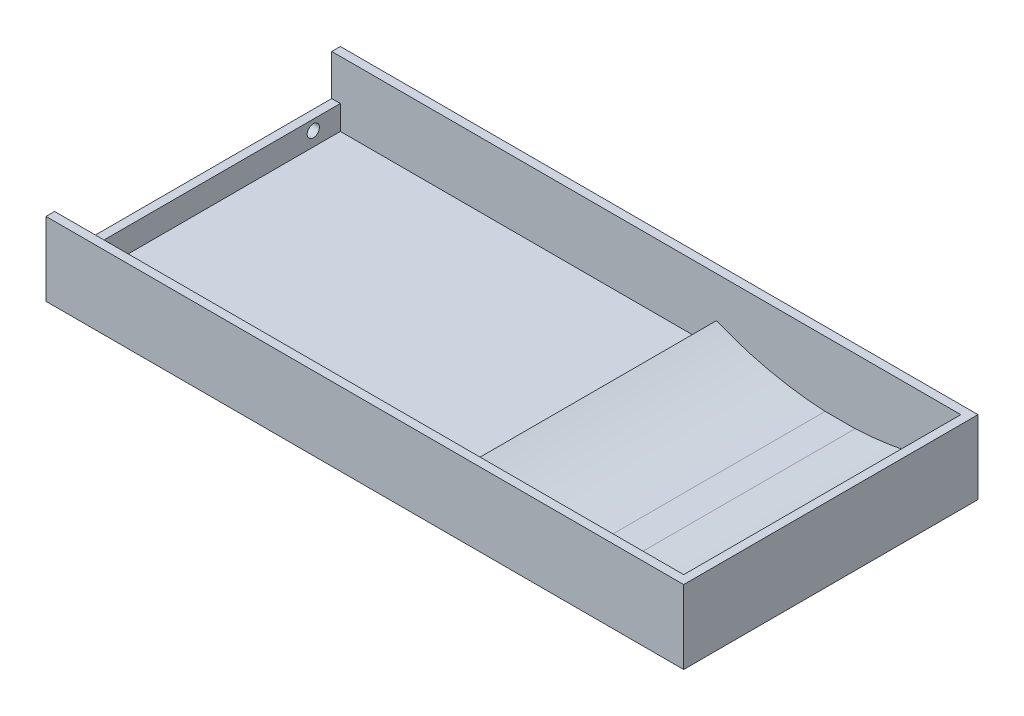
ISO-10303-21;
HEADER;
FILE_DESCRIPTION(('STEP AP214'),'2;1');
FILE_NAME('part.step','',(''),(''),'','','');
FILE_SCHEMA(('AUTOMOTIVE_DESIGN { 1 0 10303 214 1 1 1 1 }'));
ENDSEC;
DATA;
#1=APPLICATION_CONTEXT('core data for automotive mechanical design processes');
#2=APPLICATION_PROTOCOL_DEFINITION('international standard','automotive_design',2000,#1);
#3=PRODUCT_CONTEXT('',#1,'mechanical');
#4=PRODUCT('Part','Part','',(#3));
#5=PRODUCT_RELATED_PRODUCT_CATEGORY('part','',(#4));
#6=PRODUCT_DEFINITION_FORMATION('','',#4);
#7=PRODUCT_DEFINITION_CONTEXT('part definition',#1,'design');
#8=PRODUCT_DEFINITION('design','',#6,#7);
#9=PRODUCT_DEFINITION_SHAPE('','',#8);
#10=(LENGTH_UNIT() NAMED_UNIT(*) SI_UNIT(.MILLI.,.METRE.));
#11=(NAMED_UNIT(*) PLANE_ANGLE_UNIT() SI_UNIT($,.RADIAN.));
#12=(NAMED_UNIT(*) SI_UNIT($,.STERADIAN.) SOLID_ANGLE_UNIT());
#13=UNCERTAINTY_MEASURE_WITH_UNIT(LENGTH_MEASURE(1.E-05),#10,'distance_accuracy_value','');
#14=(GEOMETRIC_REPRESENTATION_CONTEXT(3) GLOBAL_UNCERTAINTY_ASSIGNED_CONTEXT((#13)) GLOBAL_UNIT_ASSIGNED_CONTEXT((#10,
#11,#12)) REPRESENTATION_CONTEXT('',''));
#15=CARTESIAN_POINT('',(0.,0.,0.));
#16=DIRECTION('',(0.,0.,1.));
#17=DIRECTION('',(1.,0.,0.));
#18=AXIS2_PLACEMENT_3D('',#15,#16,#17);
#19=CARTESIAN_POINT('',(130.,30.,56.5));
#20=DIRECTION('',(0.,0.,-1.));
#21=DIRECTION('',(-1.,0.,0.));
#22=AXIS2_PLACEMENT_3D('',#19,#20,#21);
#23=PLANE('',#22);
#24=DIRECTION('',(0.,-1.,0.));
#25=VECTOR('',#24,1.);
#26=CARTESIAN_POINT('',(-126.5,30.,56.5));
#27=LINE('',#26,#25);
#28=CARTESIAN_POINT('',(-126.5,13.3588713143466,56.5));
#29=VERTEX_POINT('',#28);
#30=CARTESIAN_POINT('',(-126.5,3.5,56.5));
#31=VERTEX_POINT('',#30);
#32=EDGE_CURVE('E187',#29,#31,#27,.T.);
#33=ORIENTED_EDGE('',*,*,#32,.F.);
#34=DIRECTION('',(-1.,0.,0.));
#35=VECTOR('',#34,1.);
#36=CARTESIAN_POINT('',(-79.2,13.3588713143466,56.5));
#37=LINE('',#36,#35);
#38=CARTESIAN_POINT('',(-130.,13.3588713143466,56.5));
#39=VERTEX_POINT('',#38);
#40=EDGE_CURVE('E144',#29,#39,#37,.T.);
#41=ORIENTED_EDGE('',*,*,#40,.T.);
#42=DIRECTION('',(0.,1.,0.));
#43=VECTOR('',#42,1.);
#44=CARTESIAN_POINT('',(-130.,13.3588713143466,56.5));
#45=LINE('',#44,#43);
#46=CARTESIAN_POINT('',(-130.,30.,56.5));
#47=VERTEX_POINT('',#46);
#48=EDGE_CURVE('E154',#39,#47,#45,.T.);
#49=ORIENTED_EDGE('',*,*,#48,.T.);
#50=DIRECTION('',(1.,0.,0.));
#51=VECTOR('',#50,1.);
#52=CARTESIAN_POINT('',(130.,30.,56.5));
#53=LINE('',#52,#51);
#54=CARTESIAN_POINT('',(126.5,30.,56.5));
#55=VERTEX_POINT('',#54);
#56=EDGE_CURVE('E202',#47,#55,#53,.T.);
#57=ORIENTED_EDGE('',*,*,#56,.T.);
#58=DIRECTION('',(0.,-1.,0.));
#59=VECTOR('',#58,1.);
#60=CARTESIAN_POINT('',(126.5,30.,56.5));
#61=LINE('',#60,#59);
#62=CARTESIAN_POINT('',(126.5,12.8468283409916,56.5));
#63=VERTEX_POINT('',#62);
#64=EDGE_CURVE('E190',#55,#63,#61,.T.);
#65=ORIENTED_EDGE('',*,*,#64,.T.);
#66=CARTESIAN_POINT('',(77.3064193913041,135.633379651327,56.5));
#67=DIRECTION('',(0.,0.,-1.));
#68=DIRECTION('',(-1.,0.,0.));
#69=AXIS2_PLACEMENT_3D('',#66,#67,#68);
#70=CIRCLE('',#69,132.27450833698);
#71=CARTESIAN_POINT('',(83.4150638979187,3.5,56.5));
#72=VERTEX_POINT('',#71);
#73=EDGE_CURVE('E59',#72,#63,#70,.F.);
#74=ORIENTED_EDGE('',*,*,#73,.F.);
#75=DIRECTION('',(1.,0.,0.));
#76=VECTOR('',#75,1.);
#77=CARTESIAN_POINT('',(130.,3.5,56.5));
#78=LINE('',#77,#76);
#79=CARTESIAN_POINT('',(71.1977748846894,3.5,56.5));
#80=VERTEX_POINT('',#79);
#81=EDGE_CURVE('E186',#80,#72,#78,.T.);
#82=ORIENTED_EDGE('',*,*,#81,.F.);
#83=CARTESIAN_POINT('',(77.3064193913041,135.633379651327,56.5));
#84=DIRECTION('',(0.,0.,-1.));
#85=DIRECTION('',(-1.,0.,0.));
#86=AXIS2_PLACEMENT_3D('',#83,#84,#85);
#87=CIRCLE('',#86,132.27450833698);
#88=CARTESIAN_POINT('',(26.8535684635359,13.3588713143466,56.5));
#89=VERTEX_POINT('',#88);
#90=EDGE_CURVE('E180',#89,#80,#87,.F.);
#91=ORIENTED_EDGE('',*,*,#90,.F.);
#92=DIRECTION('',(0.,1.,0.));
#93=VECTOR('',#92,1.);
#94=CARTESIAN_POINT('',(26.8535684635359,30.,56.5));
#95=LINE('',#94,#93);
#96=CARTESIAN_POINT('',(26.8535684635359,3.5,56.5));
#97=VERTEX_POINT('',#96);
#98=EDGE_CURVE('E177',#97,#89,#95,.T.);
#99=ORIENTED_EDGE('',*,*,#98,.F.);
#100=EDGE_CURVE('E194',#31,#97,#78,.T.);
#101=ORIENTED_EDGE('',*,*,#100,.F.);
#102=EDGE_LOOP('',(#33,#41,#49,#57,#65,#74,#82,#91,#99,#101));
#103=FACE_BOUND('',#102,.T.);
#104=ADVANCED_FACE('F35',(#103),#23,.T.);
#105=CARTESIAN_POINT('',(130.,30.,-56.5));
#106=DIRECTION('',(0.,0.,1.));
#107=DIRECTION('',(1.,0.,0.));
#108=AXIS2_PLACEMENT_3D('',#105,#106,#107);
#109=PLANE('',#108);
#110=DIRECTION('',(-1.,0.,0.));
#111=VECTOR('',#110,1.);
#112=CARTESIAN_POINT('',(-79.2,13.3588713143466,-56.5));
#113=LINE('',#112,#111);
#114=CARTESIAN_POINT('',(-126.5,13.3588713143466,-56.5));
#115=VERTEX_POINT('',#114);
#116=CARTESIAN_POINT('',(-130.,13.3588713143466,-56.5));
#117=VERTEX_POINT('',#116);
#118=EDGE_CURVE('E52',#115,#117,#113,.T.);
#119=ORIENTED_EDGE('',*,*,#118,.F.);
#120=DIRECTION('',(0.,-1.,0.));
#121=VECTOR('',#120,1.);
#122=CARTESIAN_POINT('',(-126.5,30.,-56.5));
#123=LINE('',#122,#121);
#124=CARTESIAN_POINT('',(-126.5,3.5,-56.5));
#125=VERTEX_POINT('',#124);
#126=EDGE_CURVE('E191',#115,#125,#123,.T.);
#127=ORIENTED_EDGE('',*,*,#126,.T.);
#128=DIRECTION('',(-1.,0.,0.));
#129=VECTOR('',#128,1.);
#130=CARTESIAN_POINT('',(130.,3.5,-56.5));
#131=LINE('',#130,#129);
#132=CARTESIAN_POINT('',(26.8535684635359,3.5,-56.5));
#133=VERTEX_POINT('',#132);
#134=EDGE_CURVE('E196',#133,#125,#131,.T.);
#135=ORIENTED_EDGE('',*,*,#134,.F.);
#136=DIRECTION('',(0.,1.,0.));
#137=VECTOR('',#136,1.);
#138=CARTESIAN_POINT('',(26.8535684635359,0.,-56.5));
#139=LINE('',#138,#137);
#140=CARTESIAN_POINT('',(26.8535684635359,13.3588713143466,-56.5));
#141=VERTEX_POINT('',#140);
#142=EDGE_CURVE('E172',#133,#141,#139,.T.);
#143=ORIENTED_EDGE('',*,*,#142,.T.);
#144=CARTESIAN_POINT('',(77.3064193913041,135.633379651327,-56.5));
#145=DIRECTION('',(0.,0.,1.));
#146=DIRECTION('',(1.,0.,0.));
#147=AXIS2_PLACEMENT_3D('',#144,#145,#146);
#148=CIRCLE('',#147,132.27450833698);
#149=CARTESIAN_POINT('',(71.1977748846894,3.5,-56.5));
#150=VERTEX_POINT('',#149);
#151=EDGE_CURVE('E169',#141,#150,#148,.T.);
#152=ORIENTED_EDGE('',*,*,#151,.T.);
#153=CARTESIAN_POINT('',(83.4150638979187,3.5,-56.5));
#154=VERTEX_POINT('',#153);
#155=EDGE_CURVE('E200',#154,#150,#131,.T.);
#156=ORIENTED_EDGE('',*,*,#155,.F.);
#157=CARTESIAN_POINT('',(77.3064193913041,135.633379651327,-56.5));
#158=DIRECTION('',(0.,0.,1.));
#159=DIRECTION('',(1.,0.,0.));
#160=AXIS2_PLACEMENT_3D('',#157,#158,#159);
#161=CIRCLE('',#160,132.27450833698);
#162=CARTESIAN_POINT('',(126.5,12.8468283409916,-56.5));
#163=VERTEX_POINT('',#162);
#164=EDGE_CURVE('E44',#163,#154,#161,.F.);
#165=ORIENTED_EDGE('',*,*,#164,.F.);
#166=DIRECTION('',(0.,-1.,0.));
#167=VECTOR('',#166,1.);
#168=CARTESIAN_POINT('',(126.5,30.,-56.5));
#169=LINE('',#168,#167);
#170=CARTESIAN_POINT('',(126.5,30.,-56.5));
#171=VERTEX_POINT('',#170);
#172=EDGE_CURVE('E193',#171,#163,#169,.T.);
#173=ORIENTED_EDGE('',*,*,#172,.F.);
#174=DIRECTION('',(-1.,0.,0.));
#175=VECTOR('',#174,1.);
#176=CARTESIAN_POINT('',(130.,30.,-56.5));
#177=LINE('',#176,#175);
#178=CARTESIAN_POINT('',(-130.,30.,-56.5));
#179=VERTEX_POINT('',#178);
#180=EDGE_CURVE('E150',#171,#179,#177,.T.);
#181=ORIENTED_EDGE('',*,*,#180,.T.);
#182=DIRECTION('',(0.,-1.,0.));
#183=VECTOR('',#182,1.);
#184=CARTESIAN_POINT('',(-130.,13.3588713143466,-56.5));
#185=LINE('',#184,#183);
#186=EDGE_CURVE('E147',#179,#117,#185,.T.);
#187=ORIENTED_EDGE('',*,*,#186,.T.);
#188=EDGE_LOOP('',(#119,#127,#135,#143,#152,#156,#165,#173,#181,#187));
#189=FACE_BOUND('',#188,.T.);
#190=ADVANCED_FACE('F148',(#189),#109,.T.);
#191=CARTESIAN_POINT('',(0.,3.5,0.));
#192=DIRECTION('',(0.,1.,0.));
#193=DIRECTION('',(0.,0.,1.));
#194=AXIS2_PLACEMENT_3D('',#191,#192,#193);
#195=PLANE('',#194);
#196=DIRECTION('',(0.,0.,-1.));
#197=VECTOR('',#196,1.);
#198=CARTESIAN_POINT('',(83.4150638979187,3.5,60.));
#199=LINE('',#198,#197);
#200=EDGE_CURVE('E166',#154,#72,#199,.F.);
#201=ORIENTED_EDGE('',*,*,#200,.F.);
#202=ORIENTED_EDGE('',*,*,#155,.T.);
#203=DIRECTION('',(0.,0.,-1.));
#204=VECTOR('',#203,1.);
#205=CARTESIAN_POINT('',(71.1977748846894,3.5,60.));
#206=LINE('',#205,#204);
#207=EDGE_CURVE('E240',#80,#150,#206,.T.);
#208=ORIENTED_EDGE('',*,*,#207,.F.);
#209=ORIENTED_EDGE('',*,*,#81,.T.);
#210=EDGE_LOOP('',(#201,#202,#208,#209));
#211=FACE_BOUND('',#210,.T.);
#212=ADVANCED_FACE('F264',(#211),#195,.T.);
#213=CARTESIAN_POINT('',(-130.,30.,60.));
#214=DIRECTION('',(1.,0.,0.));
#215=DIRECTION('',(0.,0.,-1.));
#216=AXIS2_PLACEMENT_3D('',#213,#214,#215);
#217=PLANE('',#216);
#218=CARTESIAN_POINT('',(-130.,9.24148681060163,38.9742849195575));
#219=DIRECTION('',(-1.,0.,0.));
#220=DIRECTION('',(0.,0.,1.));
#221=AXIS2_PLACEMENT_3D('',#218,#219,#220);
#222=CIRCLE('',#221,2.33678796091566);
#223=CARTESIAN_POINT('',(-130.,9.24148681060163,41.3110728804731));
#224=VERTEX_POINT('',#223);
#225=EDGE_CURVE('E254',#224,#224,#222,.T.);
#226=ORIENTED_EDGE('',*,*,#225,.F.);
#227=EDGE_LOOP('',(#226));
#228=FACE_BOUND('',#227,.T.);
#229=CARTESIAN_POINT('',(-130.,9.24148681060163,-45.4839085249654));
#230=DIRECTION('',(-1.,0.,0.));
#231=DIRECTION('',(0.,0.,1.));
#232=AXIS2_PLACEMENT_3D('',#229,#230,#231);
#233=CIRCLE('',#232,2.50370138669534);
#234=CARTESIAN_POINT('',(-130.,9.24148681060163,-42.9802071382701));
#235=VERTEX_POINT('',#234);
#236=EDGE_CURVE('E246',#235,#235,#233,.T.);
#237=ORIENTED_EDGE('',*,*,#236,.F.);
#238=EDGE_LOOP('',(#237));
#239=FACE_BOUND('',#238,.T.);
#240=DIRECTION('',(0.,0.,1.));
#241=VECTOR('',#240,1.);
#242=CARTESIAN_POINT('',(-130.,30.,60.));
#243=LINE('',#242,#241);
#244=CARTESIAN_POINT('',(-130.,30.,60.));
#245=VERTEX_POINT('',#244);
#246=EDGE_CURVE('E211',#47,#245,#243,.T.);
#247=ORIENTED_EDGE('',*,*,#246,.F.);
#248=ORIENTED_EDGE('',*,*,#48,.F.);
#249=DIRECTION('',(0.,0.,1.));
#250=VECTOR('',#249,1.);
#251=CARTESIAN_POINT('',(-130.,13.3588713143466,-56.5));
#252=LINE('',#251,#250);
#253=EDGE_CURVE('E140',#117,#39,#252,.T.);
#254=ORIENTED_EDGE('',*,*,#253,.F.);
#255=ORIENTED_EDGE('',*,*,#186,.F.);
#256=CARTESIAN_POINT('',(-130.,30.,-60.));
#257=VERTEX_POINT('',#256);
#258=EDGE_CURVE('E208',#257,#179,#243,.T.);
#259=ORIENTED_EDGE('',*,*,#258,.F.);
#260=DIRECTION('',(0.,-1.,0.));
#261=VECTOR('',#260,1.);
#262=CARTESIAN_POINT('',(-130.,30.,-60.));
#263=LINE('',#262,#261);
#264=CARTESIAN_POINT('',(-130.,0.,-60.));
#265=VERTEX_POINT('',#264);
#266=EDGE_CURVE('E217',#257,#265,#263,.T.);
#267=ORIENTED_EDGE('',*,*,#266,.T.);
#268=DIRECTION('',(0.,0.,1.));
#269=VECTOR('',#268,1.);
#270=CARTESIAN_POINT('',(-130.,0.,60.));
#271=LINE('',#270,#269);
#272=CARTESIAN_POINT('',(-130.,0.,60.));
#273=VERTEX_POINT('',#272);
#274=EDGE_CURVE('E189',#265,#273,#271,.T.);
#275=ORIENTED_EDGE('',*,*,#274,.T.);
#276=DIRECTION('',(0.,-1.,0.));
#277=VECTOR('',#276,1.);
#278=CARTESIAN_POINT('',(-130.,30.,60.));
#279=LINE('',#278,#277);
#280=EDGE_CURVE('E234',#245,#273,#279,.T.);
#281=ORIENTED_EDGE('',*,*,#280,.F.);
#282=EDGE_LOOP('',(#247,#248,#254,#255,#259,#267,#275,#281));
#283=FACE_BOUND('',#282,.T.);
#284=ADVANCED_FACE('F37',(#228,#239,#283),#217,.F.);
#285=CARTESIAN_POINT('',(130.,30.,60.));
#286=DIRECTION('',(0.,0.,-1.));
#287=DIRECTION('',(-1.,0.,0.));
#288=AXIS2_PLACEMENT_3D('',#285,#286,#287);
#289=PLANE('',#288);
#290=DIRECTION('',(1.,0.,0.));
#291=VECTOR('',#290,1.);
#292=CARTESIAN_POINT('',(130.,0.,60.));
#293=LINE('',#292,#291);
#294=CARTESIAN_POINT('',(130.,0.,60.));
#295=VERTEX_POINT('',#294);
#296=EDGE_CURVE('E220',#273,#295,#293,.T.);
#297=ORIENTED_EDGE('',*,*,#296,.T.);
#298=DIRECTION('',(0.,-1.,0.));
#299=VECTOR('',#298,1.);
#300=CARTESIAN_POINT('',(130.,30.,60.));
#301=LINE('',#300,#299);
#302=CARTESIAN_POINT('',(130.,30.,60.));
#303=VERTEX_POINT('',#302);
#304=EDGE_CURVE('E231',#303,#295,#301,.T.);
#305=ORIENTED_EDGE('',*,*,#304,.F.);
#306=DIRECTION('',(1.,0.,0.));
#307=VECTOR('',#306,1.);
#308=CARTESIAN_POINT('',(130.,30.,60.));
#309=LINE('',#308,#307);
#310=EDGE_CURVE('E210',#245,#303,#309,.T.);
#311=ORIENTED_EDGE('',*,*,#310,.F.);
#312=ORIENTED_EDGE('',*,*,#280,.T.);
#313=EDGE_LOOP('',(#297,#305,#311,#312));
#314=FACE_BOUND('',#313,.T.);
#315=ADVANCED_FACE('F263',(#314),#289,.F.);
#316=CARTESIAN_POINT('',(130.,30.,60.));
#317=DIRECTION('',(-1.,0.,0.));
#318=DIRECTION('',(0.,0.,1.));
#319=AXIS2_PLACEMENT_3D('',#316,#317,#318);
#320=PLANE('',#319);
#321=DIRECTION('',(0.,0.,-1.));
#322=VECTOR('',#321,1.);
#323=CARTESIAN_POINT('',(130.,0.,60.));
#324=LINE('',#323,#322);
#325=CARTESIAN_POINT('',(130.,0.,-60.));
#326=VERTEX_POINT('',#325);
#327=EDGE_CURVE('E222',#295,#326,#324,.T.);
#328=ORIENTED_EDGE('',*,*,#327,.T.);
#329=DIRECTION('',(0.,-1.,0.));
#330=VECTOR('',#329,1.);
#331=CARTESIAN_POINT('',(130.,30.,-60.));
#332=LINE('',#331,#330);
#333=CARTESIAN_POINT('',(130.,30.,-60.));
#334=VERTEX_POINT('',#333);
#335=EDGE_CURVE('E228',#334,#326,#332,.T.);
#336=ORIENTED_EDGE('',*,*,#335,.F.);
#337=DIRECTION('',(0.,0.,-1.));
#338=VECTOR('',#337,1.);
#339=CARTESIAN_POINT('',(130.,30.,60.));
#340=LINE('',#339,#338);
#341=EDGE_CURVE('E213',#303,#334,#340,.T.);
#342=ORIENTED_EDGE('',*,*,#341,.F.);
#343=ORIENTED_EDGE('',*,*,#304,.T.);
#344=EDGE_LOOP('',(#328,#336,#342,#343));
#345=FACE_BOUND('',#344,.T.);
#346=ADVANCED_FACE('F269',(#345),#320,.F.);
#347=CARTESIAN_POINT('',(130.,30.,-60.));
#348=DIRECTION('',(0.,0.,1.));
#349=DIRECTION('',(1.,0.,0.));
#350=AXIS2_PLACEMENT_3D('',#347,#348,#349);
#351=PLANE('',#350);
#352=DIRECTION('',(-1.,0.,0.));
#353=VECTOR('',#352,1.);
#354=CARTESIAN_POINT('',(130.,0.,-60.));
#355=LINE('',#354,#353);
#356=EDGE_CURVE('E224',#326,#265,#355,.T.);
#357=ORIENTED_EDGE('',*,*,#356,.T.);
#358=ORIENTED_EDGE('',*,*,#266,.F.);
#359=DIRECTION('',(-1.,0.,0.));
#360=VECTOR('',#359,1.);
#361=CARTESIAN_POINT('',(130.,30.,-60.));
#362=LINE('',#361,#360);
#363=EDGE_CURVE('E215',#334,#257,#362,.T.);
#364=ORIENTED_EDGE('',*,*,#363,.F.);
#365=ORIENTED_EDGE('',*,*,#335,.T.);
#366=EDGE_LOOP('',(#357,#358,#364,#365));
#367=FACE_BOUND('',#366,.T.);
#368=ADVANCED_FACE('F296',(#367),#351,.F.);
#369=CARTESIAN_POINT('',(0.,30.,0.));
#370=DIRECTION('',(0.,1.,0.));
#371=DIRECTION('',(0.,0.,1.));
#372=AXIS2_PLACEMENT_3D('',#369,#370,#371);
#373=PLANE('',#372);
#374=ORIENTED_EDGE('',*,*,#56,.F.);
#375=ORIENTED_EDGE('',*,*,#246,.T.);
#376=ORIENTED_EDGE('',*,*,#310,.T.);
#377=ORIENTED_EDGE('',*,*,#341,.T.);
#378=ORIENTED_EDGE('',*,*,#363,.T.);
#379=ORIENTED_EDGE('',*,*,#258,.T.);
#380=ORIENTED_EDGE('',*,*,#180,.F.);
#381=DIRECTION('',(0.,0.,-1.));
#382=VECTOR('',#381,1.);
#383=CARTESIAN_POINT('',(126.5,30.,60.));
#384=LINE('',#383,#382);
#385=EDGE_CURVE('E204',#55,#171,#384,.T.);
#386=ORIENTED_EDGE('',*,*,#385,.F.);
#387=EDGE_LOOP('',(#374,#375,#376,#377,#378,#379,#380,#386));
#388=FACE_BOUND('',#387,.T.);
#389=ADVANCED_FACE('F292',(#388),#373,.T.);
#390=CARTESIAN_POINT('',(0.,0.,0.));
#391=DIRECTION('',(0.,1.,0.));
#392=DIRECTION('',(0.,0.,1.));
#393=AXIS2_PLACEMENT_3D('',#390,#391,#392);
#394=PLANE('',#393);
#395=ORIENTED_EDGE('',*,*,#274,.F.);
#396=ORIENTED_EDGE('',*,*,#356,.F.);
#397=ORIENTED_EDGE('',*,*,#327,.F.);
#398=ORIENTED_EDGE('',*,*,#296,.F.);
#399=EDGE_LOOP('',(#395,#396,#397,#398));
#400=FACE_BOUND('',#399,.T.);
#401=ADVANCED_FACE('F295',(#400),#394,.F.);
#402=CARTESIAN_POINT('',(-126.5,30.,60.));
#403=DIRECTION('',(1.,0.,0.));
#404=DIRECTION('',(0.,0.,-1.));
#405=AXIS2_PLACEMENT_3D('',#402,#403,#404);
#406=PLANE('',#405);
#407=CARTESIAN_POINT('',(-126.5,9.24148681060163,38.9742849195575));
#408=DIRECTION('',(1.,0.,0.));
#409=DIRECTION('',(0.,0.,-1.));
#410=AXIS2_PLACEMENT_3D('',#407,#408,#409);
#411=CIRCLE('',#410,2.33678796091566);
#412=CARTESIAN_POINT('',(-126.5,9.24148681060163,36.6374969586418));
#413=VERTEX_POINT('',#412);
#414=EDGE_CURVE('E39',#413,#413,#411,.T.);
#415=ORIENTED_EDGE('',*,*,#414,.F.);
#416=EDGE_LOOP('',(#415));
#417=FACE_BOUND('',#416,.T.);
#418=CARTESIAN_POINT('',(-126.5,9.24148681060163,-45.4839085249654));
#419=DIRECTION('',(1.,0.,0.));
#420=DIRECTION('',(0.,0.,-1.));
#421=AXIS2_PLACEMENT_3D('',#418,#419,#420);
#422=CIRCLE('',#421,2.50370138669534);
#423=CARTESIAN_POINT('',(-126.5,9.24148681060163,-47.9876099116607));
#424=VERTEX_POINT('',#423);
#425=EDGE_CURVE('E244',#424,#424,#422,.T.);
#426=ORIENTED_EDGE('',*,*,#425,.F.);
#427=EDGE_LOOP('',(#426));
#428=FACE_BOUND('',#427,.T.);
#429=DIRECTION('',(0.,0.,-1.));
#430=VECTOR('',#429,1.);
#431=CARTESIAN_POINT('',(-126.5,13.3588713143466,60.));
#432=LINE('',#431,#430);
#433=EDGE_CURVE('E11',#29,#115,#432,.T.);
#434=ORIENTED_EDGE('',*,*,#433,.F.);
#435=ORIENTED_EDGE('',*,*,#32,.T.);
#436=DIRECTION('',(0.,0.,1.));
#437=VECTOR('',#436,1.);
#438=CARTESIAN_POINT('',(-126.5,3.5,60.));
#439=LINE('',#438,#437);
#440=EDGE_CURVE('E183',#125,#31,#439,.T.);
#441=ORIENTED_EDGE('',*,*,#440,.F.);
#442=ORIENTED_EDGE('',*,*,#126,.F.);
#443=EDGE_LOOP('',(#434,#435,#441,#442));
#444=FACE_BOUND('',#443,.T.);
#445=ADVANCED_FACE('F283',(#417,#428,#444),#406,.T.);
#446=CARTESIAN_POINT('',(126.5,30.,60.));
#447=DIRECTION('',(-1.,0.,0.));
#448=DIRECTION('',(0.,0.,1.));
#449=AXIS2_PLACEMENT_3D('',#446,#447,#448);
#450=PLANE('',#449);
#451=DIRECTION('',(0.,0.,-1.));
#452=VECTOR('',#451,1.);
#453=CARTESIAN_POINT('',(126.5,12.8468283409916,60.));
#454=LINE('',#453,#452);
#455=EDGE_CURVE('E161',#63,#163,#454,.T.);
#456=ORIENTED_EDGE('',*,*,#455,.F.);
#457=ORIENTED_EDGE('',*,*,#64,.F.);
#458=ORIENTED_EDGE('',*,*,#385,.T.);
#459=ORIENTED_EDGE('',*,*,#172,.T.);
#460=EDGE_LOOP('',(#456,#457,#458,#459));
#461=FACE_BOUND('',#460,.T.);
#462=ADVANCED_FACE('F285',(#461),#450,.T.);
#463=DIRECTION('',(0.,0.,1.));
#464=VECTOR('',#463,1.);
#465=CARTESIAN_POINT('',(26.8535684635359,3.5,0.));
#466=LINE('',#465,#464);
#467=EDGE_CURVE('E237',#133,#97,#466,.T.);
#468=ORIENTED_EDGE('',*,*,#467,.F.);
#469=ORIENTED_EDGE('',*,*,#134,.T.);
#470=ORIENTED_EDGE('',*,*,#440,.T.);
#471=ORIENTED_EDGE('',*,*,#100,.T.);
#472=EDGE_LOOP('',(#468,#469,#470,#471));
#473=FACE_BOUND('',#472,.T.);
#474=ADVANCED_FACE('F273',(#473),#195,.T.);
#475=CARTESIAN_POINT('',(77.3064193913041,135.633379651327,60.));
#476=DIRECTION('',(0.,0.,-1.));
#477=DIRECTION('',(-1.,0.,0.));
#478=AXIS2_PLACEMENT_3D('',#475,#476,#477);
#479=CYLINDRICAL_SURFACE('',#478,132.27450833698);
#480=DIRECTION('',(0.,0.,-1.));
#481=VECTOR('',#480,1.);
#482=CARTESIAN_POINT('',(26.8535684635359,13.3588713143466,60.));
#483=LINE('',#482,#481);
#484=EDGE_CURVE('E174',#89,#141,#483,.T.);
#485=ORIENTED_EDGE('',*,*,#484,.F.);
#486=ORIENTED_EDGE('',*,*,#90,.T.);
#487=ORIENTED_EDGE('',*,*,#207,.T.);
#488=ORIENTED_EDGE('',*,*,#151,.F.);
#489=EDGE_LOOP('',(#485,#486,#487,#488));
#490=FACE_BOUND('',#489,.T.);
#491=ADVANCED_FACE('F290',(#490),#479,.F.);
#492=CARTESIAN_POINT('',(26.8535684635359,0.,60.));
#493=DIRECTION('',(-1.,0.,0.));
#494=DIRECTION('',(0.,0.,1.));
#495=AXIS2_PLACEMENT_3D('',#492,#493,#494);
#496=PLANE('',#495);
#497=ORIENTED_EDGE('',*,*,#467,.T.);
#498=ORIENTED_EDGE('',*,*,#98,.T.);
#499=ORIENTED_EDGE('',*,*,#484,.T.);
#500=ORIENTED_EDGE('',*,*,#142,.F.);
#501=EDGE_LOOP('',(#497,#498,#499,#500));
#502=FACE_BOUND('',#501,.T.);
#503=ADVANCED_FACE('F328',(#502),#496,.T.);
#504=CARTESIAN_POINT('',(77.3064193913041,135.633379651327,60.));
#505=DIRECTION('',(0.,0.,-1.));
#506=DIRECTION('',(-1.,0.,0.));
#507=AXIS2_PLACEMENT_3D('',#504,#505,#506);
#508=CYLINDRICAL_SURFACE('',#507,132.27450833698);
#509=ORIENTED_EDGE('',*,*,#164,.T.);
#510=ORIENTED_EDGE('',*,*,#200,.T.);
#511=ORIENTED_EDGE('',*,*,#73,.T.);
#512=ORIENTED_EDGE('',*,*,#455,.T.);
#513=EDGE_LOOP('',(#509,#510,#511,#512));
#514=FACE_BOUND('',#513,.T.);
#515=ADVANCED_FACE('F334',(#514),#508,.F.);
#516=CARTESIAN_POINT('',(-79.2,13.3588713143466,-56.5));
#517=DIRECTION('',(0.,-1.,0.));
#518=DIRECTION('',(0.,0.,-1.));
#519=AXIS2_PLACEMENT_3D('',#516,#517,#518);
#520=PLANE('',#519);
#521=ORIENTED_EDGE('',*,*,#433,.T.);
#522=ORIENTED_EDGE('',*,*,#118,.T.);
#523=ORIENTED_EDGE('',*,*,#253,.T.);
#524=ORIENTED_EDGE('',*,*,#40,.F.);
#525=EDGE_LOOP('',(#521,#522,#523,#524));
#526=FACE_BOUND('',#525,.T.);
#527=ADVANCED_FACE('F138',(#526),#520,.F.);
#528=CARTESIAN_POINT('',(-79.2,9.24148681060163,-45.4839085249654));
#529=DIRECTION('',(-1.,0.,0.));
#530=DIRECTION('',(0.,0.,1.));
#531=AXIS2_PLACEMENT_3D('',#528,#529,#530);
#532=CYLINDRICAL_SURFACE('',#531,2.50370138669534);
#533=ORIENTED_EDGE('',*,*,#425,.T.);
#534=EDGE_LOOP('',(#533));
#535=FACE_BOUND('',#534,.T.);
#536=ORIENTED_EDGE('',*,*,#236,.T.);
#537=EDGE_LOOP('',(#536));
#538=FACE_BOUND('',#537,.T.);
#539=ADVANCED_FACE('F341',(#535,#538),#532,.F.);
#540=CARTESIAN_POINT('',(-79.2,9.24148681060163,38.9742849195575));
#541=DIRECTION('',(-1.,0.,0.));
#542=DIRECTION('',(0.,0.,1.));
#543=AXIS2_PLACEMENT_3D('',#540,#541,#542);
#544=CYLINDRICAL_SURFACE('',#543,2.33678796091566);
#545=ORIENTED_EDGE('',*,*,#414,.T.);
#546=EDGE_LOOP('',(#545));
#547=FACE_BOUND('',#546,.T.);
#548=ORIENTED_EDGE('',*,*,#225,.T.);
#549=EDGE_LOOP('',(#548));
#550=FACE_BOUND('',#549,.T.);
#551=ADVANCED_FACE('F259',(#547,#550),#544,.F.);
#552=CLOSED_SHELL('',(#104,#190,#212,#284,#315,#346,#368,#389,#401,#445,#462,#474,#491,#503,
#515,#527,#539,#551));
#553=MANIFOLD_SOLID_BREP('B2',#552);
#554=ADVANCED_BREP_SHAPE_REPRESENTATION('',(#18,#553),#14);
#555=SHAPE_DEFINITION_REPRESENTATION(#9,#554);
ENDSEC;
END-ISO-10303-21;
